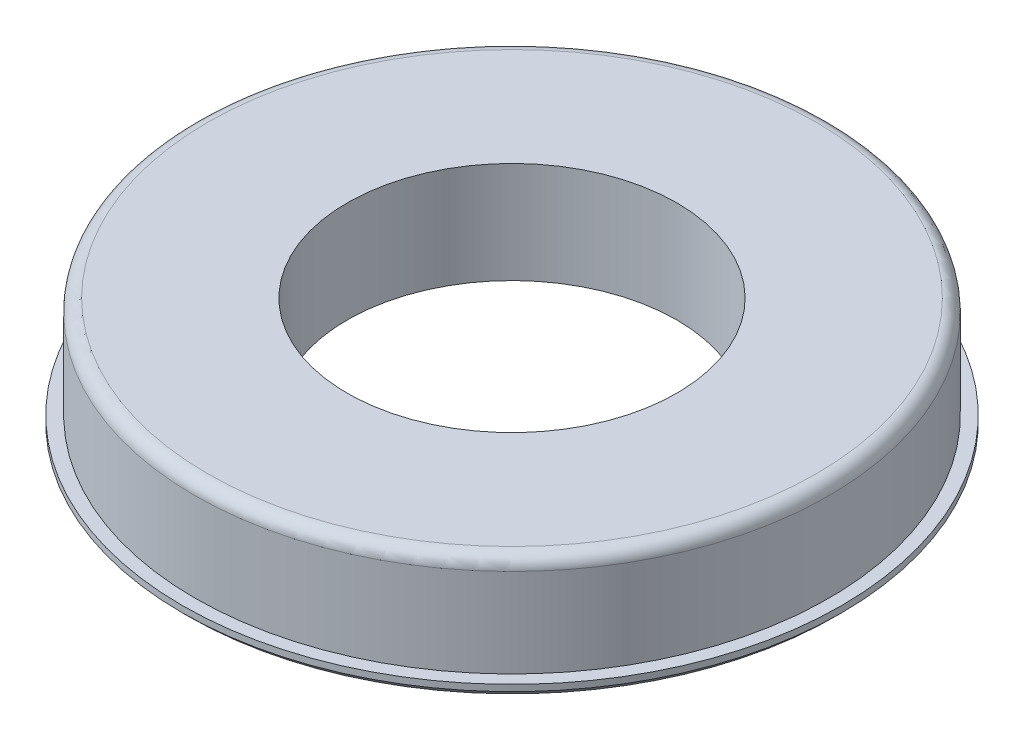
ISO-10303-21;
HEADER;
FILE_DESCRIPTION(('STEP AP214'),'2;1');
FILE_NAME('part.step','',(''),(''),'','','');
FILE_SCHEMA(('AUTOMOTIVE_DESIGN { 1 0 10303 214 1 1 1 1 }'));
ENDSEC;
DATA;
#1=APPLICATION_CONTEXT('core data for automotive mechanical design processes');
#2=APPLICATION_PROTOCOL_DEFINITION('international standard','automotive_design',2000,#1);
#3=PRODUCT_CONTEXT('',#1,'mechanical');
#4=PRODUCT('Part','Part','',(#3));
#5=PRODUCT_RELATED_PRODUCT_CATEGORY('part','',(#4));
#6=PRODUCT_DEFINITION_FORMATION('','',#4);
#7=PRODUCT_DEFINITION_CONTEXT('part definition',#1,'design');
#8=PRODUCT_DEFINITION('design','',#6,#7);
#9=PRODUCT_DEFINITION_SHAPE('','',#8);
#10=(LENGTH_UNIT() NAMED_UNIT(*) SI_UNIT(.MILLI.,.METRE.));
#11=(NAMED_UNIT(*) PLANE_ANGLE_UNIT() SI_UNIT($,.RADIAN.));
#12=(NAMED_UNIT(*) SI_UNIT($,.STERADIAN.) SOLID_ANGLE_UNIT());
#13=UNCERTAINTY_MEASURE_WITH_UNIT(LENGTH_MEASURE(1.E-05),#10,'distance_accuracy_value','');
#14=(GEOMETRIC_REPRESENTATION_CONTEXT(3) GLOBAL_UNCERTAINTY_ASSIGNED_CONTEXT((#13)) GLOBAL_UNIT_ASSIGNED_CONTEXT((#10,
#11,#12)) REPRESENTATION_CONTEXT('',''));
#15=CARTESIAN_POINT('',(0.,0.,0.));
#16=DIRECTION('',(0.,0.,1.));
#17=DIRECTION('',(1.,0.,0.));
#18=AXIS2_PLACEMENT_3D('',#15,#16,#17);
#19=CARTESIAN_POINT('',(0.,0.,0.));
#20=DIRECTION('',(0.,-1.,0.));
#21=DIRECTION('',(0.,0.,-1.));
#22=AXIS2_PLACEMENT_3D('',#19,#20,#21);
#23=CYLINDRICAL_SURFACE('',#22,26.);
#24=CARTESIAN_POINT('',(0.,-0.499999999999996,0.));
#25=DIRECTION('',(0.,1.,0.));
#26=DIRECTION('',(0.,0.,1.));
#27=AXIS2_PLACEMENT_3D('',#24,#25,#26);
#28=CIRCLE('',#27,26.);
#29=CARTESIAN_POINT('',(0.,-0.499999999999996,26.));
#30=VERTEX_POINT('',#29);
#31=EDGE_CURVE('E10',#30,#30,#28,.T.);
#32=ORIENTED_EDGE('',*,*,#31,.T.);
#33=EDGE_LOOP('',(#32));
#34=FACE_BOUND('',#33,.T.);
#35=CARTESIAN_POINT('',(0.,0.,0.));
#36=DIRECTION('',(0.,-1.,0.));
#37=DIRECTION('',(0.,0.,-1.));
#38=AXIS2_PLACEMENT_3D('',#35,#36,#37);
#39=CIRCLE('',#38,26.);
#40=CARTESIAN_POINT('',(0.,0.,-26.));
#41=VERTEX_POINT('',#40);
#42=EDGE_CURVE('E80',#41,#41,#39,.T.);
#43=ORIENTED_EDGE('',*,*,#42,.T.);
#44=EDGE_LOOP('',(#43));
#45=FACE_BOUND('',#44,.T.);
#46=ADVANCED_FACE('F41',(#34,#45),#23,.T.);
#47=CARTESIAN_POINT('',(-26.,0.,0.));
#48=DIRECTION('',(0.,-1.,0.));
#49=DIRECTION('',(0.,0.,-1.));
#50=AXIS2_PLACEMENT_3D('',#47,#48,#49);
#51=PLANE('',#50);
#52=ORIENTED_EDGE('',*,*,#42,.F.);
#53=EDGE_LOOP('',(#52));
#54=FACE_BOUND('',#53,.T.);
#55=CARTESIAN_POINT('',(0.,0.,0.));
#56=DIRECTION('',(0.,-1.,0.));
#57=DIRECTION('',(0.,0.,-1.));
#58=AXIS2_PLACEMENT_3D('',#55,#56,#57);
#59=CIRCLE('',#58,25.);
#60=CARTESIAN_POINT('',(0.,0.,-25.));
#61=VERTEX_POINT('',#60);
#62=EDGE_CURVE('E83',#61,#61,#59,.T.);
#63=ORIENTED_EDGE('',*,*,#62,.T.);
#64=EDGE_LOOP('',(#63));
#65=FACE_BOUND('',#64,.T.);
#66=ADVANCED_FACE('F115',(#54,#65),#51,.F.);
#67=CARTESIAN_POINT('',(0.,0.,0.));
#68=DIRECTION('',(0.,-1.,0.));
#69=DIRECTION('',(0.,0.,-1.));
#70=AXIS2_PLACEMENT_3D('',#67,#68,#69);
#71=CYLINDRICAL_SURFACE('',#70,25.);
#72=CARTESIAN_POINT('',(0.,7.,0.));
#73=DIRECTION('',(0.,-1.,0.));
#74=DIRECTION('',(0.,0.,-1.));
#75=AXIS2_PLACEMENT_3D('',#72,#73,#74);
#76=CIRCLE('',#75,25.);
#77=CARTESIAN_POINT('',(0.,7.,-25.));
#78=VERTEX_POINT('',#77);
#79=EDGE_CURVE('E77',#78,#78,#76,.T.);
#80=ORIENTED_EDGE('',*,*,#79,.T.);
#81=EDGE_LOOP('',(#80));
#82=FACE_BOUND('',#81,.T.);
#83=ORIENTED_EDGE('',*,*,#62,.F.);
#84=EDGE_LOOP('',(#83));
#85=FACE_BOUND('',#84,.T.);
#86=ADVANCED_FACE('F122',(#82,#85),#71,.T.);
#87=CARTESIAN_POINT('',(-25.,8.,0.));
#88=DIRECTION('',(0.,-1.,0.));
#89=DIRECTION('',(0.,0.,-1.));
#90=AXIS2_PLACEMENT_3D('',#87,#88,#89);
#91=PLANE('',#90);
#92=CARTESIAN_POINT('',(0.,8.,0.));
#93=DIRECTION('',(0.,-1.,0.));
#94=DIRECTION('',(0.,0.,-1.));
#95=AXIS2_PLACEMENT_3D('',#92,#93,#94);
#96=CIRCLE('',#95,24.);
#97=CARTESIAN_POINT('',(0.,8.,-24.));
#98=VERTEX_POINT('',#97);
#99=EDGE_CURVE('E74',#98,#98,#96,.F.);
#100=ORIENTED_EDGE('',*,*,#99,.T.);
#101=EDGE_LOOP('',(#100));
#102=FACE_BOUND('',#101,.T.);
#103=CARTESIAN_POINT('',(0.,8.,0.));
#104=DIRECTION('',(0.,-1.,0.));
#105=DIRECTION('',(0.,0.,-1.));
#106=AXIS2_PLACEMENT_3D('',#103,#104,#105);
#107=CIRCLE('',#106,13.);
#108=CARTESIAN_POINT('',(0.,8.,-13.));
#109=VERTEX_POINT('',#108);
#110=EDGE_CURVE('E86',#109,#109,#107,.T.);
#111=ORIENTED_EDGE('',*,*,#110,.T.);
#112=EDGE_LOOP('',(#111));
#113=FACE_BOUND('',#112,.T.);
#114=ADVANCED_FACE('F228',(#102,#113),#91,.F.);
#115=CARTESIAN_POINT('',(0.,0.,0.));
#116=DIRECTION('',(0.,-1.,0.));
#117=DIRECTION('',(0.,0.,-1.));
#118=AXIS2_PLACEMENT_3D('',#115,#116,#117);
#119=CYLINDRICAL_SURFACE('',#118,13.);
#120=ORIENTED_EDGE('',*,*,#110,.F.);
#121=EDGE_LOOP('',(#120));
#122=FACE_BOUND('',#121,.T.);
#123=CARTESIAN_POINT('',(0.,0.,0.));
#124=DIRECTION('',(0.,-1.,0.));
#125=DIRECTION('',(0.,0.,-1.));
#126=AXIS2_PLACEMENT_3D('',#123,#124,#125);
#127=CIRCLE('',#126,13.);
#128=CARTESIAN_POINT('',(0.,0.,-13.));
#129=VERTEX_POINT('',#128);
#130=EDGE_CURVE('E89',#129,#129,#127,.T.);
#131=ORIENTED_EDGE('',*,*,#130,.T.);
#132=EDGE_LOOP('',(#131));
#133=FACE_BOUND('',#132,.T.);
#134=ADVANCED_FACE('F111',(#122,#133),#119,.F.);
#135=CARTESIAN_POINT('',(-13.,0.,0.));
#136=DIRECTION('',(0.,1.,0.));
#137=DIRECTION('',(0.,0.,1.));
#138=AXIS2_PLACEMENT_3D('',#135,#136,#137);
#139=PLANE('',#138);
#140=ORIENTED_EDGE('',*,*,#130,.F.);
#141=EDGE_LOOP('',(#140));
#142=FACE_BOUND('',#141,.T.);
#143=CARTESIAN_POINT('',(0.,0.,0.));
#144=DIRECTION('',(0.,-1.,0.));
#145=DIRECTION('',(0.,0.,-1.));
#146=AXIS2_PLACEMENT_3D('',#143,#144,#145);
#147=CIRCLE('',#146,15.5);
#148=CARTESIAN_POINT('',(0.,0.,-15.5));
#149=VERTEX_POINT('',#148);
#150=EDGE_CURVE('E92',#149,#149,#147,.T.);
#151=ORIENTED_EDGE('',*,*,#150,.T.);
#152=EDGE_LOOP('',(#151));
#153=FACE_BOUND('',#152,.T.);
#154=ADVANCED_FACE('F96',(#142,#153),#139,.F.);
#155=CARTESIAN_POINT('',(0.,0.,0.));
#156=DIRECTION('',(0.,-1.,0.));
#157=DIRECTION('',(0.,0.,-1.));
#158=AXIS2_PLACEMENT_3D('',#155,#156,#157);
#159=CYLINDRICAL_SURFACE('',#158,15.5);
#160=CARTESIAN_POINT('',(0.,1.5,0.));
#161=DIRECTION('',(0.,1.,0.));
#162=DIRECTION('',(0.,0.,1.));
#163=AXIS2_PLACEMENT_3D('',#160,#161,#162);
#164=CIRCLE('',#163,15.5);
#165=CARTESIAN_POINT('',(0.,1.5,15.5));
#166=VERTEX_POINT('',#165);
#167=EDGE_CURVE('E62',#166,#166,#164,.F.);
#168=ORIENTED_EDGE('',*,*,#167,.T.);
#169=EDGE_LOOP('',(#168));
#170=FACE_BOUND('',#169,.T.);
#171=ORIENTED_EDGE('',*,*,#150,.F.);
#172=EDGE_LOOP('',(#171));
#173=FACE_BOUND('',#172,.T.);
#174=ADVANCED_FACE('F98',(#170,#173),#159,.T.);
#175=CARTESIAN_POINT('',(-22.5,2.5,0.));
#176=DIRECTION('',(0.,1.,0.));
#177=DIRECTION('',(0.,0.,1.));
#178=AXIS2_PLACEMENT_3D('',#175,#176,#177);
#179=PLANE('',#178);
#180=CARTESIAN_POINT('',(0.,2.5,0.));
#181=DIRECTION('',(0.,1.,0.));
#182=DIRECTION('',(0.,0.,1.));
#183=AXIS2_PLACEMENT_3D('',#180,#181,#182);
#184=CIRCLE('',#183,21.5);
#185=CARTESIAN_POINT('',(0.,2.5,21.5));
#186=VERTEX_POINT('',#185);
#187=EDGE_CURVE('E68',#186,#186,#184,.F.);
#188=ORIENTED_EDGE('',*,*,#187,.T.);
#189=EDGE_LOOP('',(#188));
#190=FACE_BOUND('',#189,.T.);
#191=CARTESIAN_POINT('',(0.,2.5,0.));
#192=DIRECTION('',(0.,1.,0.));
#193=DIRECTION('',(0.,0.,1.));
#194=AXIS2_PLACEMENT_3D('',#191,#192,#193);
#195=CIRCLE('',#194,16.5);
#196=CARTESIAN_POINT('',(0.,2.5,16.5));
#197=VERTEX_POINT('',#196);
#198=EDGE_CURVE('E71',#197,#197,#195,.T.);
#199=ORIENTED_EDGE('',*,*,#198,.T.);
#200=EDGE_LOOP('',(#199));
#201=FACE_BOUND('',#200,.T.);
#202=ADVANCED_FACE('F100',(#190,#201),#179,.F.);
#203=CARTESIAN_POINT('',(0.,0.,0.));
#204=DIRECTION('',(0.,-1.,0.));
#205=DIRECTION('',(0.,0.,-1.));
#206=AXIS2_PLACEMENT_3D('',#203,#204,#205);
#207=CYLINDRICAL_SURFACE('',#206,22.5);
#208=CARTESIAN_POINT('',(0.,-0.499999999999992,0.));
#209=DIRECTION('',(0.,1.,0.));
#210=DIRECTION('',(0.,0.,1.));
#211=AXIS2_PLACEMENT_3D('',#208,#209,#210);
#212=CIRCLE('',#211,22.5);
#213=CARTESIAN_POINT('',(0.,-0.499999999999992,22.5));
#214=VERTEX_POINT('',#213);
#215=EDGE_CURVE('E57',#214,#214,#212,.F.);
#216=ORIENTED_EDGE('',*,*,#215,.T.);
#217=EDGE_LOOP('',(#216));
#218=FACE_BOUND('',#217,.T.);
#219=CARTESIAN_POINT('',(0.,1.5,0.));
#220=DIRECTION('',(0.,1.,0.));
#221=DIRECTION('',(0.,0.,1.));
#222=AXIS2_PLACEMENT_3D('',#219,#220,#221);
#223=CIRCLE('',#222,22.5);
#224=CARTESIAN_POINT('',(0.,1.5,22.5));
#225=VERTEX_POINT('',#224);
#226=EDGE_CURVE('E65',#225,#225,#223,.T.);
#227=ORIENTED_EDGE('',*,*,#226,.T.);
#228=EDGE_LOOP('',(#227));
#229=FACE_BOUND('',#228,.T.);
#230=ADVANCED_FACE('F107',(#218,#229),#207,.F.);
#231=CARTESIAN_POINT('',(-22.5,-1.,0.));
#232=DIRECTION('',(0.,1.,0.));
#233=DIRECTION('',(0.,0.,1.));
#234=AXIS2_PLACEMENT_3D('',#231,#232,#233);
#235=PLANE('',#234);
#236=CARTESIAN_POINT('',(0.,-1.,0.));
#237=DIRECTION('',(0.,1.,0.));
#238=DIRECTION('',(0.,0.,1.));
#239=AXIS2_PLACEMENT_3D('',#236,#237,#238);
#240=CIRCLE('',#239,23.);
#241=CARTESIAN_POINT('',(0.,-1.,23.));
#242=VERTEX_POINT('',#241);
#243=EDGE_CURVE('E49',#242,#242,#240,.T.);
#244=ORIENTED_EDGE('',*,*,#243,.T.);
#245=EDGE_LOOP('',(#244));
#246=FACE_BOUND('',#245,.T.);
#247=CARTESIAN_POINT('',(0.,-1.,0.));
#248=DIRECTION('',(0.,1.,0.));
#249=DIRECTION('',(0.,0.,1.));
#250=AXIS2_PLACEMENT_3D('',#247,#248,#249);
#251=CIRCLE('',#250,25.5);
#252=CARTESIAN_POINT('',(0.,-1.,25.5));
#253=VERTEX_POINT('',#252);
#254=EDGE_CURVE('E53',#253,#253,#251,.F.);
#255=ORIENTED_EDGE('',*,*,#254,.T.);
#256=EDGE_LOOP('',(#255));
#257=FACE_BOUND('',#256,.T.);
#258=ADVANCED_FACE('F132',(#246,#257),#235,.F.);
#259=CARTESIAN_POINT('',(0.,7.,0.));
#260=DIRECTION('',(0.,-1.,0.));
#261=DIRECTION('',(0.,0.,-1.));
#262=AXIS2_PLACEMENT_3D('',#259,#260,#261);
#263=TOROIDAL_SURFACE('',#262,24.,1.);
#264=ORIENTED_EDGE('',*,*,#99,.F.);
#265=EDGE_LOOP('',(#264));
#266=FACE_BOUND('',#265,.T.);
#267=ORIENTED_EDGE('',*,*,#79,.F.);
#268=EDGE_LOOP('',(#267));
#269=FACE_BOUND('',#268,.T.);
#270=ADVANCED_FACE('F128',(#266,#269),#263,.T.);
#271=CARTESIAN_POINT('',(0.,1.5,0.));
#272=DIRECTION('',(0.,1.,0.));
#273=DIRECTION('',(0.,0.,1.));
#274=AXIS2_PLACEMENT_3D('',#271,#272,#273);
#275=TOROIDAL_SURFACE('',#274,21.5,1.);
#276=ORIENTED_EDGE('',*,*,#226,.F.);
#277=EDGE_LOOP('',(#276));
#278=FACE_BOUND('',#277,.T.);
#279=ORIENTED_EDGE('',*,*,#187,.F.);
#280=EDGE_LOOP('',(#279));
#281=FACE_BOUND('',#280,.T.);
#282=ADVANCED_FACE('F131',(#278,#281),#275,.F.);
#283=CARTESIAN_POINT('',(0.,1.5,0.));
#284=DIRECTION('',(0.,1.,0.));
#285=DIRECTION('',(0.,0.,1.));
#286=AXIS2_PLACEMENT_3D('',#283,#284,#285);
#287=TOROIDAL_SURFACE('',#286,16.5,1.);
#288=ORIENTED_EDGE('',*,*,#198,.F.);
#289=EDGE_LOOP('',(#288));
#290=FACE_BOUND('',#289,.T.);
#291=ORIENTED_EDGE('',*,*,#167,.F.);
#292=EDGE_LOOP('',(#291));
#293=FACE_BOUND('',#292,.T.);
#294=ADVANCED_FACE('F136',(#290,#293),#287,.F.);
#295=CARTESIAN_POINT('',(0.,-0.499999999999992,0.));
#296=DIRECTION('',(0.,-1.,0.));
#297=DIRECTION('',(0.,0.,-1.));
#298=AXIS2_PLACEMENT_3D('',#295,#296,#297);
#299=CONICAL_SURFACE('',#298,22.5,0.785398163397455);
#300=ORIENTED_EDGE('',*,*,#243,.F.);
#301=EDGE_LOOP('',(#300));
#302=FACE_BOUND('',#301,.T.);
#303=ORIENTED_EDGE('',*,*,#215,.F.);
#304=EDGE_LOOP('',(#303));
#305=FACE_BOUND('',#304,.T.);
#306=ADVANCED_FACE('F138',(#302,#305),#299,.F.);
#307=CARTESIAN_POINT('',(0.,-1.,0.));
#308=DIRECTION('',(0.,1.,0.));
#309=DIRECTION('',(0.,0.,1.));
#310=AXIS2_PLACEMENT_3D('',#307,#308,#309);
#311=CONICAL_SURFACE('',#310,25.5,0.785398163397438);
#312=ORIENTED_EDGE('',*,*,#31,.F.);
#313=EDGE_LOOP('',(#312));
#314=FACE_BOUND('',#313,.T.);
#315=ORIENTED_EDGE('',*,*,#254,.F.);
#316=EDGE_LOOP('',(#315));
#317=FACE_BOUND('',#316,.T.);
#318=ADVANCED_FACE('F44',(#314,#317),#311,.T.);
#319=CLOSED_SHELL('',(#46,#66,#86,#114,#134,#154,#174,#202,#230,#258,#270,#282,#294,#306,#318));
#320=MANIFOLD_SOLID_BREP('B2',#319);
#321=ADVANCED_BREP_SHAPE_REPRESENTATION('',(#18,#320),#14);
#322=SHAPE_DEFINITION_REPRESENTATION(#9,#321);
ENDSEC;
END-ISO-10303-21;
